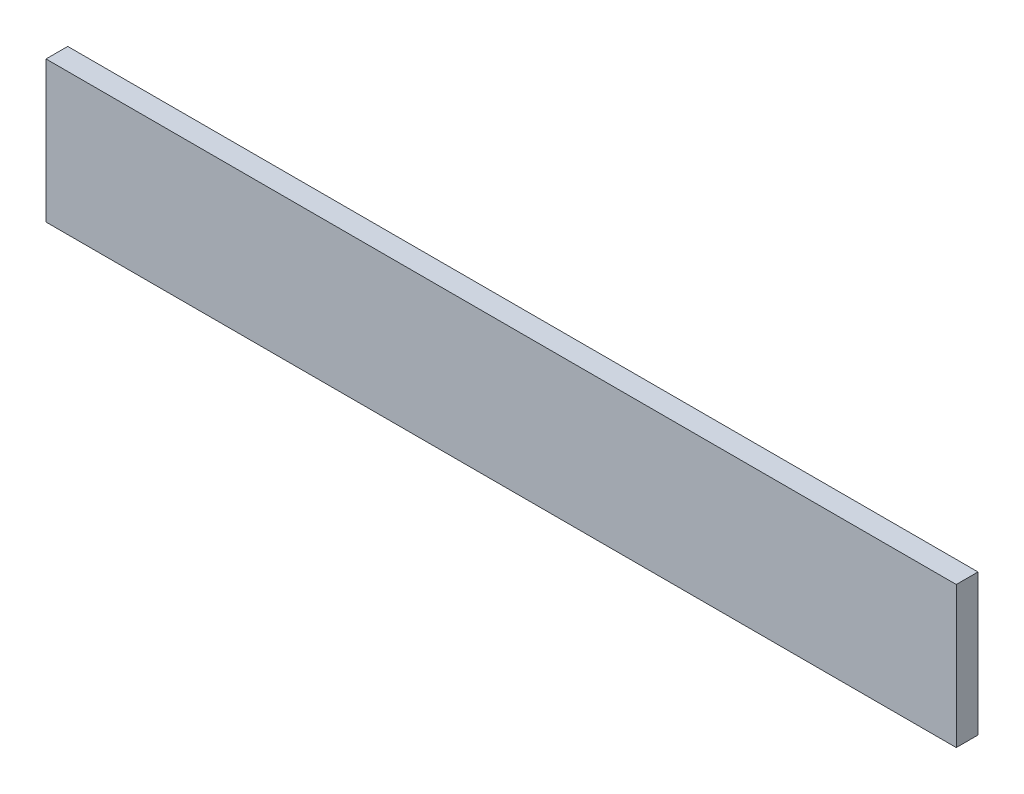
ISO-10303-21;
HEADER;
FILE_DESCRIPTION(('STEP AP214'),'2;1');
FILE_NAME('part.step','',(''),(''),'','','');
FILE_SCHEMA(('AUTOMOTIVE_DESIGN { 1 0 10303 214 1 1 1 1 }'));
ENDSEC;
DATA;
#1=APPLICATION_CONTEXT('core data for automotive mechanical design processes');
#2=APPLICATION_PROTOCOL_DEFINITION('international standard','automotive_design',2000,#1);
#3=PRODUCT_CONTEXT('',#1,'mechanical');
#4=PRODUCT('Part','Part','',(#3));
#5=PRODUCT_RELATED_PRODUCT_CATEGORY('part','',(#4));
#6=PRODUCT_DEFINITION_FORMATION('','',#4);
#7=PRODUCT_DEFINITION_CONTEXT('part definition',#1,'design');
#8=PRODUCT_DEFINITION('design','',#6,#7);
#9=PRODUCT_DEFINITION_SHAPE('','',#8);
#10=(LENGTH_UNIT() NAMED_UNIT(*) SI_UNIT(.MILLI.,.METRE.));
#11=(NAMED_UNIT(*) PLANE_ANGLE_UNIT() SI_UNIT($,.RADIAN.));
#12=(NAMED_UNIT(*) SI_UNIT($,.STERADIAN.) SOLID_ANGLE_UNIT());
#13=UNCERTAINTY_MEASURE_WITH_UNIT(LENGTH_MEASURE(1.E-05),#10,'distance_accuracy_value','');
#14=(GEOMETRIC_REPRESENTATION_CONTEXT(3) GLOBAL_UNCERTAINTY_ASSIGNED_CONTEXT((#13)) GLOBAL_UNIT_ASSIGNED_CONTEXT((#10,
#11,#12)) REPRESENTATION_CONTEXT('',''));
#15=CARTESIAN_POINT('',(0.,0.,0.));
#16=DIRECTION('',(0.,0.,1.));
#17=DIRECTION('',(1.,0.,0.));
#18=AXIS2_PLACEMENT_3D('',#15,#16,#17);
#19=CARTESIAN_POINT('',(265.9580533,41.275,12.7));
#20=DIRECTION('',(-1.,0.,0.));
#21=DIRECTION('',(0.,0.,1.));
#22=AXIS2_PLACEMENT_3D('',#19,#20,#21);
#23=PLANE('',#22);
#24=DIRECTION('',(0.,1.,0.));
#25=VECTOR('',#24,1.);
#26=CARTESIAN_POINT('',(265.9580533,41.275,0.));
#27=LINE('',#26,#25);
#28=CARTESIAN_POINT('',(265.9580533,-41.275,0.));
#29=VERTEX_POINT('',#28);
#30=CARTESIAN_POINT('',(265.9580533,41.275,0.));
#31=VERTEX_POINT('',#30);
#32=EDGE_CURVE('E97',#29,#31,#27,.T.);
#33=ORIENTED_EDGE('',*,*,#32,.T.);
#34=DIRECTION('',(0.,0.,-1.));
#35=VECTOR('',#34,1.);
#36=CARTESIAN_POINT('',(265.9580533,41.275,12.7));
#37=LINE('',#36,#35);
#38=CARTESIAN_POINT('',(265.9580533,41.275,12.7));
#39=VERTEX_POINT('',#38);
#40=EDGE_CURVE('E11',#39,#31,#37,.T.);
#41=ORIENTED_EDGE('',*,*,#40,.F.);
#42=DIRECTION('',(0.,1.,0.));
#43=VECTOR('',#42,1.);
#44=CARTESIAN_POINT('',(265.9580533,41.275,12.7));
#45=LINE('',#44,#43);
#46=CARTESIAN_POINT('',(265.9580533,-41.275,12.7));
#47=VERTEX_POINT('',#46);
#48=EDGE_CURVE('E85',#47,#39,#45,.T.);
#49=ORIENTED_EDGE('',*,*,#48,.F.);
#50=DIRECTION('',(0.,0.,-1.));
#51=VECTOR('',#50,1.);
#52=CARTESIAN_POINT('',(265.9580533,-41.275,12.7));
#53=LINE('',#52,#51);
#54=EDGE_CURVE('E93',#47,#29,#53,.T.);
#55=ORIENTED_EDGE('',*,*,#54,.T.);
#56=EDGE_LOOP('',(#33,#41,#49,#55));
#57=FACE_BOUND('',#56,.T.);
#58=ADVANCED_FACE('F34',(#57),#23,.F.);
#59=CARTESIAN_POINT('',(-265.9580533,41.275,12.7));
#60=DIRECTION('',(0.,-1.,0.));
#61=DIRECTION('',(0.,0.,-1.));
#62=AXIS2_PLACEMENT_3D('',#59,#60,#61);
#63=PLANE('',#62);
#64=DIRECTION('',(-1.,0.,0.));
#65=VECTOR('',#64,1.);
#66=CARTESIAN_POINT('',(-265.9580533,41.275,0.));
#67=LINE('',#66,#65);
#68=CARTESIAN_POINT('',(-265.9580533,41.275,0.));
#69=VERTEX_POINT('',#68);
#70=EDGE_CURVE('E89',#31,#69,#67,.T.);
#71=ORIENTED_EDGE('',*,*,#70,.T.);
#72=DIRECTION('',(0.,0.,-1.));
#73=VECTOR('',#72,1.);
#74=CARTESIAN_POINT('',(-265.9580533,41.275,12.7));
#75=LINE('',#74,#73);
#76=CARTESIAN_POINT('',(-265.9580533,41.275,12.7));
#77=VERTEX_POINT('',#76);
#78=EDGE_CURVE('E42',#77,#69,#75,.T.);
#79=ORIENTED_EDGE('',*,*,#78,.F.);
#80=DIRECTION('',(-1.,0.,0.));
#81=VECTOR('',#80,1.);
#82=CARTESIAN_POINT('',(-265.9580533,41.275,12.7));
#83=LINE('',#82,#81);
#84=EDGE_CURVE('E80',#39,#77,#83,.T.);
#85=ORIENTED_EDGE('',*,*,#84,.F.);
#86=ORIENTED_EDGE('',*,*,#40,.T.);
#87=EDGE_LOOP('',(#71,#79,#85,#86));
#88=FACE_BOUND('',#87,.T.);
#89=ADVANCED_FACE('F88',(#88),#63,.F.);
#90=CARTESIAN_POINT('',(-265.9580533,41.275,12.7));
#91=DIRECTION('',(1.,0.,0.));
#92=DIRECTION('',(0.,0.,-1.));
#93=AXIS2_PLACEMENT_3D('',#90,#91,#92);
#94=PLANE('',#93);
#95=DIRECTION('',(0.,-1.,0.));
#96=VECTOR('',#95,1.);
#97=CARTESIAN_POINT('',(-265.9580533,41.275,0.));
#98=LINE('',#97,#96);
#99=CARTESIAN_POINT('',(-265.9580533,-41.275,0.));
#100=VERTEX_POINT('',#99);
#101=EDGE_CURVE('E67',#69,#100,#98,.T.);
#102=ORIENTED_EDGE('',*,*,#101,.T.);
#103=DIRECTION('',(0.,0.,-1.));
#104=VECTOR('',#103,1.);
#105=CARTESIAN_POINT('',(-265.9580533,-41.275,12.7));
#106=LINE('',#105,#104);
#107=CARTESIAN_POINT('',(-265.9580533,-41.275,12.7));
#108=VERTEX_POINT('',#107);
#109=EDGE_CURVE('E90',#108,#100,#106,.T.);
#110=ORIENTED_EDGE('',*,*,#109,.F.);
#111=DIRECTION('',(0.,-1.,0.));
#112=VECTOR('',#111,1.);
#113=CARTESIAN_POINT('',(-265.9580533,41.275,12.7));
#114=LINE('',#113,#112);
#115=EDGE_CURVE('E83',#77,#108,#114,.T.);
#116=ORIENTED_EDGE('',*,*,#115,.F.);
#117=ORIENTED_EDGE('',*,*,#78,.T.);
#118=EDGE_LOOP('',(#102,#110,#116,#117));
#119=FACE_BOUND('',#118,.T.);
#120=ADVANCED_FACE('F91',(#119),#94,.F.);
#121=CARTESIAN_POINT('',(-265.9580533,-41.275,12.7));
#122=DIRECTION('',(0.,1.,0.));
#123=DIRECTION('',(0.,0.,1.));
#124=AXIS2_PLACEMENT_3D('',#121,#122,#123);
#125=PLANE('',#124);
#126=DIRECTION('',(1.,0.,0.));
#127=VECTOR('',#126,1.);
#128=CARTESIAN_POINT('',(-265.9580533,-41.275,0.));
#129=LINE('',#128,#127);
#130=EDGE_CURVE('E73',#100,#29,#129,.T.);
#131=ORIENTED_EDGE('',*,*,#130,.T.);
#132=ORIENTED_EDGE('',*,*,#54,.F.);
#133=DIRECTION('',(1.,0.,0.));
#134=VECTOR('',#133,1.);
#135=CARTESIAN_POINT('',(-265.9580533,-41.275,12.7));
#136=LINE('',#135,#134);
#137=EDGE_CURVE('E50',#108,#47,#136,.T.);
#138=ORIENTED_EDGE('',*,*,#137,.F.);
#139=ORIENTED_EDGE('',*,*,#109,.T.);
#140=EDGE_LOOP('',(#131,#132,#138,#139));
#141=FACE_BOUND('',#140,.T.);
#142=ADVANCED_FACE('F104',(#141),#125,.F.);
#143=CARTESIAN_POINT('',(0.,0.,12.7));
#144=DIRECTION('',(0.,0.,1.));
#145=DIRECTION('',(1.,0.,0.));
#146=AXIS2_PLACEMENT_3D('',#143,#144,#145);
#147=PLANE('',#146);
#148=ORIENTED_EDGE('',*,*,#48,.T.);
#149=ORIENTED_EDGE('',*,*,#84,.T.);
#150=ORIENTED_EDGE('',*,*,#115,.T.);
#151=ORIENTED_EDGE('',*,*,#137,.T.);
#152=EDGE_LOOP('',(#148,#149,#150,#151));
#153=FACE_BOUND('',#152,.T.);
#154=ADVANCED_FACE('F81',(#153),#147,.T.);
#155=CARTESIAN_POINT('',(0.,0.,0.));
#156=DIRECTION('',(0.,0.,1.));
#157=DIRECTION('',(1.,0.,0.));
#158=AXIS2_PLACEMENT_3D('',#155,#156,#157);
#159=PLANE('',#158);
#160=ORIENTED_EDGE('',*,*,#32,.F.);
#161=ORIENTED_EDGE('',*,*,#130,.F.);
#162=ORIENTED_EDGE('',*,*,#101,.F.);
#163=ORIENTED_EDGE('',*,*,#70,.F.);
#164=EDGE_LOOP('',(#160,#161,#162,#163));
#165=FACE_BOUND('',#164,.T.);
#166=ADVANCED_FACE('F107',(#165),#159,.F.);
#167=CLOSED_SHELL('',(#58,#89,#120,#142,#154,#166));
#168=MANIFOLD_SOLID_BREP('B2',#167);
#169=ADVANCED_BREP_SHAPE_REPRESENTATION('',(#18,#168),#14);
#170=SHAPE_DEFINITION_REPRESENTATION(#9,#169);
ENDSEC;
END-ISO-10303-21;
